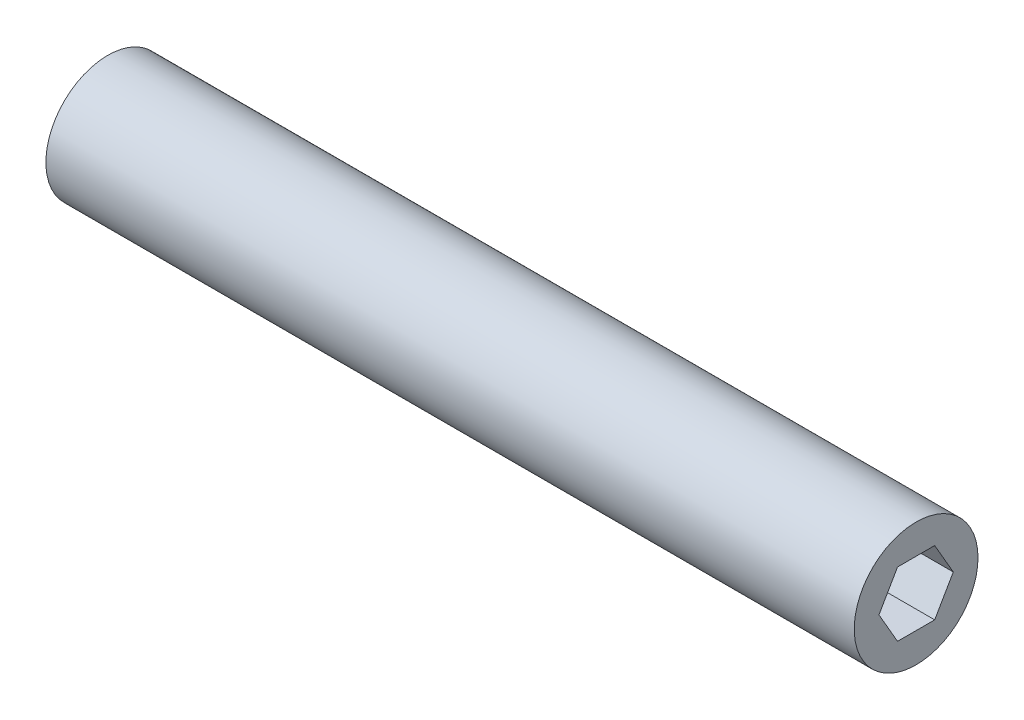
ISO-10303-21;
HEADER;
FILE_DESCRIPTION(('STEP AP214'),'2;1');
FILE_NAME('part.step','',(''),(''),'','','');
FILE_SCHEMA(('AUTOMOTIVE_DESIGN { 1 0 10303 214 1 1 1 1 }'));
ENDSEC;
DATA;
#1=APPLICATION_CONTEXT('core data for automotive mechanical design processes');
#2=APPLICATION_PROTOCOL_DEFINITION('international standard','automotive_design',2000,#1);
#3=PRODUCT_CONTEXT('',#1,'mechanical');
#4=PRODUCT('Part','Part','',(#3));
#5=PRODUCT_RELATED_PRODUCT_CATEGORY('part','',(#4));
#6=PRODUCT_DEFINITION_FORMATION('','',#4);
#7=PRODUCT_DEFINITION_CONTEXT('part definition',#1,'design');
#8=PRODUCT_DEFINITION('design','',#6,#7);
#9=PRODUCT_DEFINITION_SHAPE('','',#8);
#10=(LENGTH_UNIT() NAMED_UNIT(*) SI_UNIT(.MILLI.,.METRE.));
#11=(NAMED_UNIT(*) PLANE_ANGLE_UNIT() SI_UNIT($,.RADIAN.));
#12=(NAMED_UNIT(*) SI_UNIT($,.STERADIAN.) SOLID_ANGLE_UNIT());
#13=UNCERTAINTY_MEASURE_WITH_UNIT(LENGTH_MEASURE(1.E-05),#10,'distance_accuracy_value','');
#14=(GEOMETRIC_REPRESENTATION_CONTEXT(3) GLOBAL_UNCERTAINTY_ASSIGNED_CONTEXT((#13)) GLOBAL_UNIT_ASSIGNED_CONTEXT((#10,
#11,#12)) REPRESENTATION_CONTEXT('',''));
#15=CARTESIAN_POINT('',(0.,0.,0.));
#16=DIRECTION('',(0.,0.,1.));
#17=DIRECTION('',(1.,0.,0.));
#18=AXIS2_PLACEMENT_3D('',#15,#16,#17);
#19=CARTESIAN_POINT('',(165.89375,0.,0.));
#20=DIRECTION('',(1.,0.,0.));
#21=DIRECTION('',(0.,0.,-1.));
#22=AXIS2_PLACEMENT_3D('',#19,#20,#21);
#23=PLANE('',#22);
#24=CARTESIAN_POINT('',(165.89375,0.,0.));
#25=DIRECTION('',(1.,0.,0.));
#26=DIRECTION('',(0.,0.,-1.));
#27=AXIS2_PLACEMENT_3D('',#24,#25,#26);
#28=CIRCLE('',#27,12.7);
#29=CARTESIAN_POINT('',(165.89375,0.,-12.7));
#30=VERTEX_POINT('',#29);
#31=EDGE_CURVE('E11',#30,#30,#28,.T.);
#32=ORIENTED_EDGE('',*,*,#31,.T.);
#33=EDGE_LOOP('',(#32));
#34=FACE_BOUND('',#33,.T.);
#35=DIRECTION('',(0.,0.866025403784438,0.500000000000001));
#36=VECTOR('',#35,1.);
#37=CARTESIAN_POINT('',(165.89375,0.,-7.62564235545655));
#38=LINE('',#37,#36);
#39=CARTESIAN_POINT('',(165.89375,0.,-7.62564235545655));
#40=VERTEX_POINT('',#39);
#41=CARTESIAN_POINT('',(165.89375,6.60399999999999,-3.81282117772826));
#42=VERTEX_POINT('',#41);
#43=EDGE_CURVE('E94',#40,#42,#38,.T.);
#44=ORIENTED_EDGE('',*,*,#43,.F.);
#45=DIRECTION('',(0.,0.866025403784442,-0.499999999999995));
#46=VECTOR('',#45,1.);
#47=CARTESIAN_POINT('',(165.89375,-6.60399999999993,-3.81282117772835));
#48=LINE('',#47,#46);
#49=CARTESIAN_POINT('',(165.89375,-6.60399999999993,-3.81282117772835));
#50=VERTEX_POINT('',#49);
#51=EDGE_CURVE('E86',#50,#40,#48,.T.);
#52=ORIENTED_EDGE('',*,*,#51,.F.);
#53=DIRECTION('',(0.,0.,-1.));
#54=VECTOR('',#53,1.);
#55=CARTESIAN_POINT('',(165.89375,-6.60400000000001,3.81282117772821));
#56=LINE('',#55,#54);
#57=CARTESIAN_POINT('',(165.89375,-6.60400000000001,3.81282117772821));
#58=VERTEX_POINT('',#57);
#59=EDGE_CURVE('E114',#58,#50,#56,.T.);
#60=ORIENTED_EDGE('',*,*,#59,.F.);
#61=DIRECTION('',(0.,-0.866025403784435,-0.500000000000007));
#62=VECTOR('',#61,1.);
#63=CARTESIAN_POINT('',(165.89375,0.,7.62564235545655));
#64=LINE('',#63,#62);
#65=CARTESIAN_POINT('',(165.89375,0.,7.62564235545655));
#66=VERTEX_POINT('',#65);
#67=EDGE_CURVE('E112',#66,#58,#64,.T.);
#68=ORIENTED_EDGE('',*,*,#67,.F.);
#69=DIRECTION('',(0.,-0.866025403784442,0.499999999999995));
#70=VECTOR('',#69,1.);
#71=CARTESIAN_POINT('',(165.89375,6.60399999999996,3.81282117772831));
#72=LINE('',#71,#70);
#73=CARTESIAN_POINT('',(165.89375,6.60399999999996,3.81282117772831));
#74=VERTEX_POINT('',#73);
#75=EDGE_CURVE('E108',#74,#66,#72,.T.);
#76=ORIENTED_EDGE('',*,*,#75,.F.);
#77=DIRECTION('',(0.,0.,1.));
#78=VECTOR('',#77,1.);
#79=CARTESIAN_POINT('',(165.89375,6.60399999999999,-3.81282117772826));
#80=LINE('',#79,#78);
#81=EDGE_CURVE('E106',#42,#74,#80,.T.);
#82=ORIENTED_EDGE('',*,*,#81,.F.);
#83=EDGE_LOOP('',(#44,#52,#60,#68,#76,#82));
#84=FACE_BOUND('',#83,.T.);
#85=ADVANCED_FACE('F33',(#34,#84),#23,.T.);
#86=CARTESIAN_POINT('',(0.,0.,0.));
#87=DIRECTION('',(1.,0.,0.));
#88=DIRECTION('',(0.,0.,-1.));
#89=AXIS2_PLACEMENT_3D('',#86,#87,#88);
#90=PLANE('',#89);
#91=CARTESIAN_POINT('',(0.,0.,0.));
#92=DIRECTION('',(1.,0.,0.));
#93=DIRECTION('',(0.,0.,-1.));
#94=AXIS2_PLACEMENT_3D('',#91,#92,#93);
#95=CIRCLE('',#94,12.7);
#96=CARTESIAN_POINT('',(0.,0.,-12.7));
#97=VERTEX_POINT('',#96);
#98=EDGE_CURVE('E37',#97,#97,#95,.T.);
#99=ORIENTED_EDGE('',*,*,#98,.F.);
#100=EDGE_LOOP('',(#99));
#101=FACE_BOUND('',#100,.T.);
#102=DIRECTION('',(0.,0.866025403784442,-0.499999999999995));
#103=VECTOR('',#102,1.);
#104=CARTESIAN_POINT('',(0.,-6.60399999999993,-3.81282117772835));
#105=LINE('',#104,#103);
#106=CARTESIAN_POINT('',(0.,-6.60399999999993,-3.81282117772835));
#107=VERTEX_POINT('',#106);
#108=CARTESIAN_POINT('',(0.,0.,-7.62564235545655));
#109=VERTEX_POINT('',#108);
#110=EDGE_CURVE('E56',#107,#109,#105,.T.);
#111=ORIENTED_EDGE('',*,*,#110,.T.);
#112=DIRECTION('',(0.,0.866025403784438,0.500000000000001));
#113=VECTOR('',#112,1.);
#114=CARTESIAN_POINT('',(0.,0.,-7.62564235545655));
#115=LINE('',#114,#113);
#116=CARTESIAN_POINT('',(0.,6.60399999999999,-3.81282117772826));
#117=VERTEX_POINT('',#116);
#118=EDGE_CURVE('E101',#109,#117,#115,.T.);
#119=ORIENTED_EDGE('',*,*,#118,.T.);
#120=DIRECTION('',(0.,0.,1.));
#121=VECTOR('',#120,1.);
#122=CARTESIAN_POINT('',(0.,6.60399999999999,-3.81282117772826));
#123=LINE('',#122,#121);
#124=CARTESIAN_POINT('',(0.,6.60399999999996,3.81282117772831));
#125=VERTEX_POINT('',#124);
#126=EDGE_CURVE('E118',#117,#125,#123,.T.);
#127=ORIENTED_EDGE('',*,*,#126,.T.);
#128=DIRECTION('',(0.,-0.866025403784442,0.499999999999995));
#129=VECTOR('',#128,1.);
#130=CARTESIAN_POINT('',(0.,6.60399999999996,3.81282117772831));
#131=LINE('',#130,#129);
#132=CARTESIAN_POINT('',(0.,0.,7.62564235545655));
#133=VERTEX_POINT('',#132);
#134=EDGE_CURVE('E121',#125,#133,#131,.T.);
#135=ORIENTED_EDGE('',*,*,#134,.T.);
#136=DIRECTION('',(0.,-0.866025403784435,-0.500000000000007));
#137=VECTOR('',#136,1.);
#138=CARTESIAN_POINT('',(0.,0.,7.62564235545655));
#139=LINE('',#138,#137);
#140=CARTESIAN_POINT('',(0.,-6.60400000000001,3.81282117772821));
#141=VERTEX_POINT('',#140);
#142=EDGE_CURVE('E124',#133,#141,#139,.T.);
#143=ORIENTED_EDGE('',*,*,#142,.T.);
#144=DIRECTION('',(0.,0.,-1.));
#145=VECTOR('',#144,1.);
#146=CARTESIAN_POINT('',(0.,-6.60400000000001,3.81282117772821));
#147=LINE('',#146,#145);
#148=EDGE_CURVE('E95',#141,#107,#147,.T.);
#149=ORIENTED_EDGE('',*,*,#148,.T.);
#150=EDGE_LOOP('',(#111,#119,#127,#135,#143,#149));
#151=FACE_BOUND('',#150,.T.);
#152=ADVANCED_FACE('F141',(#101,#151),#90,.F.);
#153=CARTESIAN_POINT('',(165.89375,0.,0.));
#154=DIRECTION('',(-1.,0.,0.));
#155=DIRECTION('',(0.,0.,1.));
#156=AXIS2_PLACEMENT_3D('',#153,#154,#155);
#157=CYLINDRICAL_SURFACE('',#156,12.7);
#158=ORIENTED_EDGE('',*,*,#31,.F.);
#159=EDGE_LOOP('',(#158));
#160=FACE_BOUND('',#159,.T.);
#161=ORIENTED_EDGE('',*,*,#98,.T.);
#162=EDGE_LOOP('',(#161));
#163=FACE_BOUND('',#162,.T.);
#164=ADVANCED_FACE('F35',(#160,#163),#157,.T.);
#165=CARTESIAN_POINT('',(165.89375,-6.60399999999993,-3.81282117772835));
#166=DIRECTION('',(0.,0.499999999999995,0.866025403784441));
#167=DIRECTION('',(0.,-0.866025403784442,0.499999999999995));
#168=AXIS2_PLACEMENT_3D('',#165,#166,#167);
#169=PLANE('',#168);
#170=ORIENTED_EDGE('',*,*,#110,.F.);
#171=DIRECTION('',(-1.,0.,0.));
#172=VECTOR('',#171,1.);
#173=CARTESIAN_POINT('',(165.89375,-6.60399999999993,-3.81282117772835));
#174=LINE('',#173,#172);
#175=EDGE_CURVE('E90',#50,#107,#174,.T.);
#176=ORIENTED_EDGE('',*,*,#175,.F.);
#177=ORIENTED_EDGE('',*,*,#51,.T.);
#178=DIRECTION('',(-1.,0.,0.));
#179=VECTOR('',#178,1.);
#180=CARTESIAN_POINT('',(165.89375,0.,-7.62564235545655));
#181=LINE('',#180,#179);
#182=EDGE_CURVE('E89',#40,#109,#181,.T.);
#183=ORIENTED_EDGE('',*,*,#182,.T.);
#184=EDGE_LOOP('',(#170,#176,#177,#183));
#185=FACE_BOUND('',#184,.T.);
#186=ADVANCED_FACE('F88',(#185),#169,.T.);
#187=CARTESIAN_POINT('',(165.89375,0.,-7.62564235545655));
#188=DIRECTION('',(0.,-0.500000000000001,0.866025403784438));
#189=DIRECTION('',(0.,-0.866025403784438,-0.500000000000001));
#190=AXIS2_PLACEMENT_3D('',#187,#188,#189);
#191=PLANE('',#190);
#192=ORIENTED_EDGE('',*,*,#118,.F.);
#193=ORIENTED_EDGE('',*,*,#182,.F.);
#194=ORIENTED_EDGE('',*,*,#43,.T.);
#195=DIRECTION('',(-1.,0.,0.));
#196=VECTOR('',#195,1.);
#197=CARTESIAN_POINT('',(165.89375,6.60399999999999,-3.81282117772826));
#198=LINE('',#197,#196);
#199=EDGE_CURVE('E102',#42,#117,#198,.T.);
#200=ORIENTED_EDGE('',*,*,#199,.T.);
#201=EDGE_LOOP('',(#192,#193,#194,#200));
#202=FACE_BOUND('',#201,.T.);
#203=ADVANCED_FACE('F98',(#202),#191,.T.);
#204=CARTESIAN_POINT('',(165.89375,6.60399999999999,-3.81282117772826));
#205=DIRECTION('',(0.,-1.,0.));
#206=DIRECTION('',(0.,0.,-1.));
#207=AXIS2_PLACEMENT_3D('',#204,#205,#206);
#208=PLANE('',#207);
#209=ORIENTED_EDGE('',*,*,#126,.F.);
#210=ORIENTED_EDGE('',*,*,#199,.F.);
#211=ORIENTED_EDGE('',*,*,#81,.T.);
#212=DIRECTION('',(-1.,0.,0.));
#213=VECTOR('',#212,1.);
#214=CARTESIAN_POINT('',(165.89375,6.60399999999996,3.81282117772831));
#215=LINE('',#214,#213);
#216=EDGE_CURVE('E133',#74,#125,#215,.T.);
#217=ORIENTED_EDGE('',*,*,#216,.T.);
#218=EDGE_LOOP('',(#209,#210,#211,#217));
#219=FACE_BOUND('',#218,.T.);
#220=ADVANCED_FACE('F137',(#219),#208,.T.);
#221=CARTESIAN_POINT('',(165.89375,6.60399999999996,3.81282117772831));
#222=DIRECTION('',(0.,-0.499999999999995,-0.866025403784442));
#223=DIRECTION('',(0.,0.866025403784442,-0.499999999999995));
#224=AXIS2_PLACEMENT_3D('',#221,#222,#223);
#225=PLANE('',#224);
#226=ORIENTED_EDGE('',*,*,#134,.F.);
#227=ORIENTED_EDGE('',*,*,#216,.F.);
#228=ORIENTED_EDGE('',*,*,#75,.T.);
#229=DIRECTION('',(-1.,0.,0.));
#230=VECTOR('',#229,1.);
#231=CARTESIAN_POINT('',(165.89375,0.,7.62564235545655));
#232=LINE('',#231,#230);
#233=EDGE_CURVE('E131',#66,#133,#232,.T.);
#234=ORIENTED_EDGE('',*,*,#233,.T.);
#235=EDGE_LOOP('',(#226,#227,#228,#234));
#236=FACE_BOUND('',#235,.T.);
#237=ADVANCED_FACE('F149',(#236),#225,.T.);
#238=CARTESIAN_POINT('',(165.89375,0.,7.62564235545655));
#239=DIRECTION('',(0.,0.500000000000007,-0.866025403784435));
#240=DIRECTION('',(0.,0.866025403784435,0.500000000000007));
#241=AXIS2_PLACEMENT_3D('',#238,#239,#240);
#242=PLANE('',#241);
#243=ORIENTED_EDGE('',*,*,#142,.F.);
#244=ORIENTED_EDGE('',*,*,#233,.F.);
#245=ORIENTED_EDGE('',*,*,#67,.T.);
#246=DIRECTION('',(-1.,0.,0.));
#247=VECTOR('',#246,1.);
#248=CARTESIAN_POINT('',(165.89375,-6.60400000000001,3.81282117772821));
#249=LINE('',#248,#247);
#250=EDGE_CURVE('E48',#58,#141,#249,.T.);
#251=ORIENTED_EDGE('',*,*,#250,.T.);
#252=EDGE_LOOP('',(#243,#244,#245,#251));
#253=FACE_BOUND('',#252,.T.);
#254=ADVANCED_FACE('F147',(#253),#242,.T.);
#255=CARTESIAN_POINT('',(165.89375,-6.60400000000001,3.81282117772821));
#256=DIRECTION('',(0.,1.,0.));
#257=DIRECTION('',(0.,0.,1.));
#258=AXIS2_PLACEMENT_3D('',#255,#256,#257);
#259=PLANE('',#258);
#260=ORIENTED_EDGE('',*,*,#148,.F.);
#261=ORIENTED_EDGE('',*,*,#250,.F.);
#262=ORIENTED_EDGE('',*,*,#59,.T.);
#263=ORIENTED_EDGE('',*,*,#175,.T.);
#264=EDGE_LOOP('',(#260,#261,#262,#263));
#265=FACE_BOUND('',#264,.T.);
#266=ADVANCED_FACE('F143',(#265),#259,.T.);
#267=CLOSED_SHELL('',(#85,#152,#164,#186,#203,#220,#237,#254,#266));
#268=MANIFOLD_SOLID_BREP('B2',#267);
#269=ADVANCED_BREP_SHAPE_REPRESENTATION('',(#18,#268),#14);
#270=SHAPE_DEFINITION_REPRESENTATION(#9,#269);
ENDSEC;
END-ISO-10303-21;
